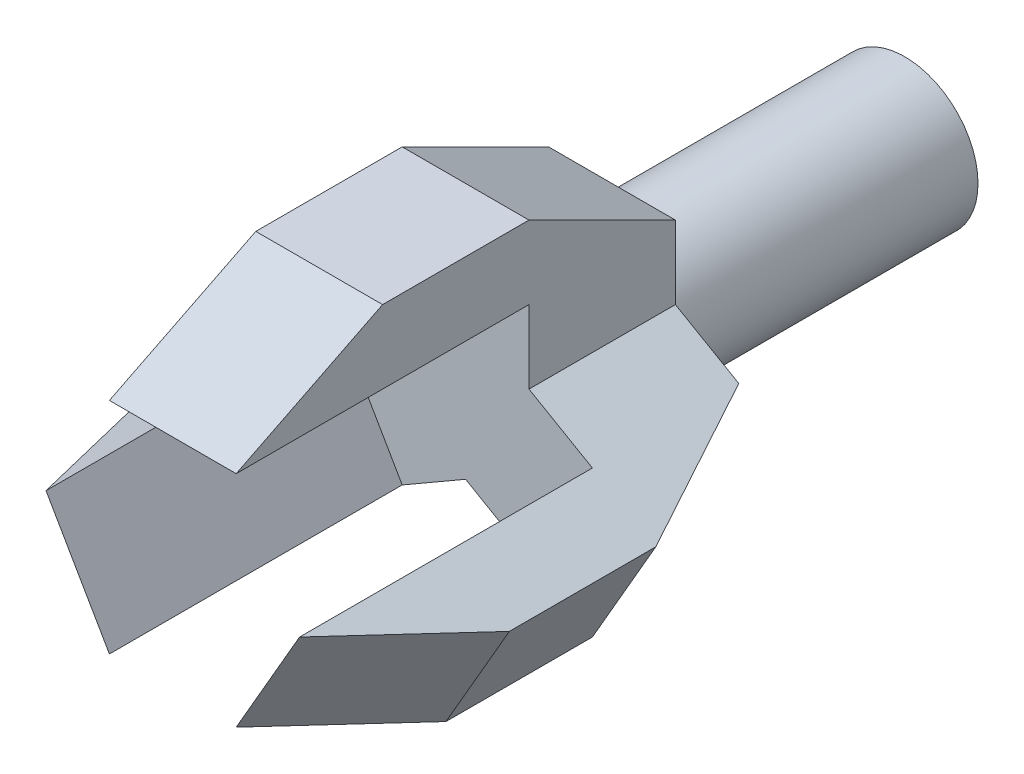
ISO-10303-21;
HEADER;
FILE_DESCRIPTION(('STEP AP214'),'2;1');
FILE_NAME('part.step','',(''),(''),'','','');
FILE_SCHEMA(('AUTOMOTIVE_DESIGN { 1 0 10303 214 1 1 1 1 }'));
ENDSEC;
DATA;
#1=APPLICATION_CONTEXT('core data for automotive mechanical design processes');
#2=APPLICATION_PROTOCOL_DEFINITION('international standard','automotive_design',2000,#1);
#3=PRODUCT_CONTEXT('',#1,'mechanical');
#4=PRODUCT('Part','Part','',(#3));
#5=PRODUCT_RELATED_PRODUCT_CATEGORY('part','',(#4));
#6=PRODUCT_DEFINITION_FORMATION('','',#4);
#7=PRODUCT_DEFINITION_CONTEXT('part definition',#1,'design');
#8=PRODUCT_DEFINITION('design','',#6,#7);
#9=PRODUCT_DEFINITION_SHAPE('','',#8);
#10=(LENGTH_UNIT() NAMED_UNIT(*) SI_UNIT(.MILLI.,.METRE.));
#11=(NAMED_UNIT(*) PLANE_ANGLE_UNIT() SI_UNIT($,.RADIAN.));
#12=(NAMED_UNIT(*) SI_UNIT($,.STERADIAN.) SOLID_ANGLE_UNIT());
#13=UNCERTAINTY_MEASURE_WITH_UNIT(LENGTH_MEASURE(1.E-05),#10,'distance_accuracy_value','');
#14=(GEOMETRIC_REPRESENTATION_CONTEXT(3) GLOBAL_UNCERTAINTY_ASSIGNED_CONTEXT((#13)) GLOBAL_UNIT_ASSIGNED_CONTEXT((#10,
#11,#12)) REPRESENTATION_CONTEXT('',''));
#15=CARTESIAN_POINT('',(0.,0.,0.));
#16=DIRECTION('',(0.,0.,1.));
#17=DIRECTION('',(1.,0.,0.));
#18=AXIS2_PLACEMENT_3D('',#15,#16,#17);
#19=CARTESIAN_POINT('',(0.,0.,200.));
#20=DIRECTION('',(0.,0.,-1.));
#21=DIRECTION('',(-1.,0.,0.));
#22=AXIS2_PLACEMENT_3D('',#19,#20,#21);
#23=CYLINDRICAL_SURFACE('',#22,50.);
#24=CARTESIAN_POINT('',(0.,0.,200.));
#25=DIRECTION('',(0.,0.,1.));
#26=DIRECTION('',(1.,0.,0.));
#27=AXIS2_PLACEMENT_3D('',#24,#25,#26);
#28=CIRCLE('',#27,50.);
#29=CARTESIAN_POINT('',(43.3012701892225,24.999999999999,200.));
#30=VERTEX_POINT('',#29);
#31=CARTESIAN_POINT('',(-43.3012701892218,25.0000000000002,200.));
#32=VERTEX_POINT('',#31);
#33=EDGE_CURVE('E11',#30,#32,#28,.T.);
#34=ORIENTED_EDGE('',*,*,#33,.F.);
#35=CARTESIAN_POINT('',(0.,0.,200.));
#36=DIRECTION('',(0.,0.,1.));
#37=DIRECTION('',(1.,0.,0.));
#38=AXIS2_PLACEMENT_3D('',#35,#36,#37);
#39=CIRCLE('',#38,50.);
#40=CARTESIAN_POINT('',(0.,-50.,200.));
#41=VERTEX_POINT('',#40);
#42=EDGE_CURVE('E361',#41,#30,#39,.T.);
#43=ORIENTED_EDGE('',*,*,#42,.F.);
#44=EDGE_CURVE('E41',#32,#41,#28,.T.);
#45=ORIENTED_EDGE('',*,*,#44,.F.);
#46=EDGE_LOOP('',(#34,#43,#45));
#47=FACE_BOUND('',#46,.T.);
#48=CARTESIAN_POINT('',(0.,0.,0.));
#49=DIRECTION('',(0.,0.,1.));
#50=DIRECTION('',(1.,0.,0.));
#51=AXIS2_PLACEMENT_3D('',#48,#49,#50);
#52=CIRCLE('',#51,50.);
#53=CARTESIAN_POINT('',(50.,0.,0.));
#54=VERTEX_POINT('',#53);
#55=EDGE_CURVE('E309',#54,#54,#52,.T.);
#56=ORIENTED_EDGE('',*,*,#55,.T.);
#57=EDGE_LOOP('',(#56));
#58=FACE_BOUND('',#57,.T.);
#59=ADVANCED_FACE('F33',(#47,#58),#23,.T.);
#60=CARTESIAN_POINT('',(0.,0.,0.));
#61=DIRECTION('',(0.,0.,1.));
#62=DIRECTION('',(1.,0.,0.));
#63=AXIS2_PLACEMENT_3D('',#60,#61,#62);
#64=PLANE('',#63);
#65=ORIENTED_EDGE('',*,*,#55,.F.);
#66=EDGE_LOOP('',(#65));
#67=FACE_BOUND('',#66,.T.);
#68=ADVANCED_FACE('F406',(#67),#64,.F.);
#69=CARTESIAN_POINT('',(5.20062834568508E-13,2.33066452422245E-13,200.));
#70=DIRECTION('',(0.,0.,1.));
#71=DIRECTION('',(1.,0.,0.));
#72=AXIS2_PLACEMENT_3D('',#69,#70,#71);
#73=PLANE('',#72);
#74=DIRECTION('',(0.,1.,0.));
#75=VECTOR('',#74,1.);
#76=CARTESIAN_POINT('',(43.3012701892218,25.0000000000002,200.));
#77=LINE('',#76,#75);
#78=CARTESIAN_POINT('',(43.3012701892224,75.0000000000016,200.));
#79=VERTEX_POINT('',#78);
#80=EDGE_CURVE('E324',#30,#79,#77,.T.);
#81=ORIENTED_EDGE('',*,*,#80,.F.);
#82=ORIENTED_EDGE('',*,*,#33,.T.);
#83=DIRECTION('',(0.,-1.,0.));
#84=VECTOR('',#83,1.);
#85=CARTESIAN_POINT('',(-43.3012701892211,74.9999999999998,200.));
#86=LINE('',#85,#84);
#87=CARTESIAN_POINT('',(-43.3012701892211,75.0000000000022,200.));
#88=VERTEX_POINT('',#87);
#89=EDGE_CURVE('E305',#88,#32,#86,.T.);
#90=ORIENTED_EDGE('',*,*,#89,.F.);
#91=DIRECTION('',(-1.,0.,0.));
#92=VECTOR('',#91,1.);
#93=CARTESIAN_POINT('',(43.3012701892223,74.9999999999991,200.));
#94=LINE('',#93,#92);
#95=EDGE_CURVE('E326',#79,#88,#94,.T.);
#96=ORIENTED_EDGE('',*,*,#95,.F.);
#97=EDGE_LOOP('',(#81,#82,#90,#96));
#98=FACE_BOUND('',#97,.T.);
#99=ADVANCED_FACE('F384',(#98),#73,.F.);
#100=CARTESIAN_POINT('',(43.3012701892218,25.0000000000002,300.));
#101=DIRECTION('',(-1.,0.,0.));
#102=DIRECTION('',(0.,-1.,0.));
#103=AXIS2_PLACEMENT_3D('',#100,#101,#102);
#104=PLANE('',#103);
#105=ORIENTED_EDGE('',*,*,#80,.T.);
#106=DIRECTION('',(0.,0.447213595499957,0.894427190999916));
#107=VECTOR('',#106,1.);
#108=CARTESIAN_POINT('',(43.3012701892224,75.0000000000017,200.));
#109=LINE('',#108,#107);
#110=CARTESIAN_POINT('',(43.3012701892228,125.000000000001,300.));
#111=VERTEX_POINT('',#110);
#112=EDGE_CURVE('E341',#79,#111,#109,.T.);
#113=ORIENTED_EDGE('',*,*,#112,.T.);
#114=DIRECTION('',(0.,0.,1.));
#115=VECTOR('',#114,1.);
#116=CARTESIAN_POINT('',(43.3012701892228,125.000000000001,300.));
#117=LINE('',#116,#115);
#118=CARTESIAN_POINT('',(43.3012701892228,125.000000000001,400.));
#119=VERTEX_POINT('',#118);
#120=EDGE_CURVE('E342',#111,#119,#117,.T.);
#121=ORIENTED_EDGE('',*,*,#120,.T.);
#122=DIRECTION('',(0.,-0.447213595499957,0.894427190999916));
#123=VECTOR('',#122,1.);
#124=CARTESIAN_POINT('',(43.3012701892228,125.000000000002,400.));
#125=LINE('',#124,#123);
#126=CARTESIAN_POINT('',(43.3012701892224,75.0000000000016,500.));
#127=VERTEX_POINT('',#126);
#128=EDGE_CURVE('E339',#119,#127,#125,.T.);
#129=ORIENTED_EDGE('',*,*,#128,.T.);
#130=DIRECTION('',(0.,0.,-1.));
#131=VECTOR('',#130,1.);
#132=CARTESIAN_POINT('',(43.3012701892224,75.0000000000016,200.));
#133=LINE('',#132,#131);
#134=CARTESIAN_POINT('',(43.3012701892224,75.0000000000016,300.));
#135=VERTEX_POINT('',#134);
#136=EDGE_CURVE('E327',#127,#135,#133,.T.);
#137=ORIENTED_EDGE('',*,*,#136,.T.);
#138=DIRECTION('',(0.,1.,0.));
#139=VECTOR('',#138,1.);
#140=CARTESIAN_POINT('',(43.3012701892218,25.0000000000002,300.));
#141=LINE('',#140,#139);
#142=CARTESIAN_POINT('',(43.3012701892225,24.999999999999,300.));
#143=VERTEX_POINT('',#142);
#144=EDGE_CURVE('E317',#143,#135,#141,.T.);
#145=ORIENTED_EDGE('',*,*,#144,.F.);
#146=DIRECTION('',(0.,0.,-1.));
#147=VECTOR('',#146,1.);
#148=CARTESIAN_POINT('',(43.3012701892218,25.0000000000002,300.));
#149=LINE('',#148,#147);
#150=EDGE_CURVE('E306',#143,#30,#149,.T.);
#151=ORIENTED_EDGE('',*,*,#150,.T.);
#152=EDGE_LOOP('',(#105,#113,#121,#129,#137,#145,#151));
#153=FACE_BOUND('',#152,.T.);
#154=ADVANCED_FACE('F336',(#153),#104,.F.);
#155=CARTESIAN_POINT('',(-43.3012701892211,74.9999999999998,300.));
#156=DIRECTION('',(1.,0.,0.));
#157=DIRECTION('',(0.,1.,0.));
#158=AXIS2_PLACEMENT_3D('',#155,#156,#157);
#159=PLANE('',#158);
#160=ORIENTED_EDGE('',*,*,#89,.T.);
#161=DIRECTION('',(0.,0.,-1.));
#162=VECTOR('',#161,1.);
#163=CARTESIAN_POINT('',(-43.3012701892215,25.0000000000008,300.));
#164=LINE('',#163,#162);
#165=CARTESIAN_POINT('',(-43.3012701892218,25.0000000000002,300.));
#166=VERTEX_POINT('',#165);
#167=EDGE_CURVE('E299',#166,#32,#164,.T.);
#168=ORIENTED_EDGE('',*,*,#167,.F.);
#169=DIRECTION('',(0.,-1.,0.));
#170=VECTOR('',#169,1.);
#171=CARTESIAN_POINT('',(-43.3012701892211,74.9999999999998,300.));
#172=LINE('',#171,#170);
#173=CARTESIAN_POINT('',(-43.3012701892211,74.9999999999998,300.));
#174=VERTEX_POINT('',#173);
#175=EDGE_CURVE('E295',#174,#166,#172,.T.);
#176=ORIENTED_EDGE('',*,*,#175,.F.);
#177=DIRECTION('',(0.,0.,1.));
#178=VECTOR('',#177,1.);
#179=CARTESIAN_POINT('',(-43.3012701892211,75.0000000000022,200.));
#180=LINE('',#179,#178);
#181=CARTESIAN_POINT('',(-43.3012701892211,75.0000000000022,500.));
#182=VERTEX_POINT('',#181);
#183=EDGE_CURVE('E49',#174,#182,#180,.T.);
#184=ORIENTED_EDGE('',*,*,#183,.T.);
#185=DIRECTION('',(0.,0.447213595499957,-0.894427190999916));
#186=VECTOR('',#185,1.);
#187=CARTESIAN_POINT('',(-43.3012701892208,125.000000000002,400.));
#188=LINE('',#187,#186);
#189=CARTESIAN_POINT('',(-43.3012701892208,125.000000000002,400.));
#190=VERTEX_POINT('',#189);
#191=EDGE_CURVE('E356',#182,#190,#188,.T.);
#192=ORIENTED_EDGE('',*,*,#191,.T.);
#193=DIRECTION('',(0.,0.,-1.));
#194=VECTOR('',#193,1.);
#195=CARTESIAN_POINT('',(-43.3012701892208,125.000000000002,300.));
#196=LINE('',#195,#194);
#197=CARTESIAN_POINT('',(-43.3012701892208,125.000000000002,300.));
#198=VERTEX_POINT('',#197);
#199=EDGE_CURVE('E350',#190,#198,#196,.T.);
#200=ORIENTED_EDGE('',*,*,#199,.T.);
#201=DIRECTION('',(0.,-0.447213595499957,-0.894427190999916));
#202=VECTOR('',#201,1.);
#203=CARTESIAN_POINT('',(-43.3012701892211,75.0000000000022,200.));
#204=LINE('',#203,#202);
#205=EDGE_CURVE('E360',#198,#88,#204,.T.);
#206=ORIENTED_EDGE('',*,*,#205,.T.);
#207=EDGE_LOOP('',(#160,#168,#176,#184,#192,#200,#206));
#208=FACE_BOUND('',#207,.T.);
#209=ADVANCED_FACE('F302',(#208),#159,.F.);
#210=CARTESIAN_POINT('',(5.20062834568508E-13,2.33066452422245E-13,300.));
#211=DIRECTION('',(0.,0.,1.));
#212=DIRECTION('',(1.,0.,0.));
#213=AXIS2_PLACEMENT_3D('',#210,#211,#212);
#214=PLANE('',#213);
#215=DIRECTION('',(-0.866025403784433,0.50000000000001,0.));
#216=VECTOR('',#215,1.);
#217=CARTESIAN_POINT('',(86.6025403784433,-9.99200722162641E-13,300.));
#218=LINE('',#217,#216);
#219=CARTESIAN_POINT('',(86.6025403784433,-9.99200722162641E-13,300.));
#220=VERTEX_POINT('',#219);
#221=EDGE_CURVE('E200',#220,#143,#218,.T.);
#222=ORIENTED_EDGE('',*,*,#221,.T.);
#223=ORIENTED_EDGE('',*,*,#144,.T.);
#224=DIRECTION('',(-1.,0.,0.));
#225=VECTOR('',#224,1.);
#226=CARTESIAN_POINT('',(43.3012701892223,74.9999999999991,300.));
#227=LINE('',#226,#225);
#228=EDGE_CURVE('E53',#135,#174,#227,.T.);
#229=ORIENTED_EDGE('',*,*,#228,.T.);
#230=ORIENTED_EDGE('',*,*,#175,.T.);
#231=DIRECTION('',(-0.866025403784448,-0.499999999999984,0.));
#232=VECTOR('',#231,1.);
#233=CARTESIAN_POINT('',(-43.3012701892218,25.0000000000002,300.));
#234=LINE('',#233,#232);
#235=CARTESIAN_POINT('',(-86.6025403784454,3.28440978118276E-13,300.));
#236=VERTEX_POINT('',#235);
#237=EDGE_CURVE('E185',#166,#236,#234,.T.);
#238=ORIENTED_EDGE('',*,*,#237,.T.);
#239=DIRECTION('',(0.499999999999985,-0.866025403784447,0.));
#240=VECTOR('',#239,1.);
#241=CARTESIAN_POINT('',(-86.6025403784433,1.57512891618694E-12,300.));
#242=LINE('',#241,#240);
#243=CARTESIAN_POINT('',(-43.3012701892229,-74.9999999999988,300.));
#244=VERTEX_POINT('',#243);
#245=EDGE_CURVE('E188',#236,#244,#242,.T.);
#246=ORIENTED_EDGE('',*,*,#245,.T.);
#247=DIRECTION('',(0.866025403784447,0.499999999999986,0.));
#248=VECTOR('',#247,1.);
#249=CARTESIAN_POINT('',(-43.3012701892229,-74.9999999999988,300.));
#250=LINE('',#249,#248);
#251=CARTESIAN_POINT('',(0.,-50.,300.));
#252=VERTEX_POINT('',#251);
#253=EDGE_CURVE('E216',#244,#252,#250,.T.);
#254=ORIENTED_EDGE('',*,*,#253,.T.);
#255=DIRECTION('',(0.866025403784432,-0.500000000000012,0.));
#256=VECTOR('',#255,1.);
#257=CARTESIAN_POINT('',(0.,-50.,300.));
#258=LINE('',#257,#256);
#259=CARTESIAN_POINT('',(43.3012701892228,-75.0000000000013,300.));
#260=VERTEX_POINT('',#259);
#261=EDGE_CURVE('E201',#252,#260,#258,.T.);
#262=ORIENTED_EDGE('',*,*,#261,.T.);
#263=DIRECTION('',(0.500000000000011,0.866025403784433,0.));
#264=VECTOR('',#263,1.);
#265=CARTESIAN_POINT('',(43.3012701892206,-75.0000000000001,300.));
#266=LINE('',#265,#264);
#267=EDGE_CURVE('E196',#260,#220,#266,.T.);
#268=ORIENTED_EDGE('',*,*,#267,.T.);
#269=EDGE_LOOP('',(#222,#223,#229,#230,#238,#246,#254,#262,#268));
#270=FACE_BOUND('',#269,.T.);
#271=ADVANCED_FACE('F292',(#270),#214,.T.);
#272=CARTESIAN_POINT('',(347.439396704133,74.9999999999993,200.));
#273=DIRECTION('',(0.,-1.,0.));
#274=DIRECTION('',(1.,0.,0.));
#275=AXIS2_PLACEMENT_3D('',#272,#273,#274);
#276=PLANE('',#275);
#277=ORIENTED_EDGE('',*,*,#228,.F.);
#278=ORIENTED_EDGE('',*,*,#136,.F.);
#279=DIRECTION('',(-1.,0.,0.));
#280=VECTOR('',#279,1.);
#281=CARTESIAN_POINT('',(347.439396704133,74.9999999999994,500.));
#282=LINE('',#281,#280);
#283=EDGE_CURVE('E347',#127,#182,#282,.T.);
#284=ORIENTED_EDGE('',*,*,#283,.T.);
#285=ORIENTED_EDGE('',*,*,#183,.F.);
#286=EDGE_LOOP('',(#277,#278,#284,#285));
#287=FACE_BOUND('',#286,.T.);
#288=ADVANCED_FACE('F395',(#287),#276,.T.);
#289=CARTESIAN_POINT('',(347.439396704133,74.9999999999993,200.));
#290=DIRECTION('',(0.,0.894427190999916,-0.447213595499957));
#291=DIRECTION('',(0.,0.447213595499957,0.894427190999916));
#292=AXIS2_PLACEMENT_3D('',#289,#290,#291);
#293=PLANE('',#292);
#294=ORIENTED_EDGE('',*,*,#112,.F.);
#295=ORIENTED_EDGE('',*,*,#95,.T.);
#296=ORIENTED_EDGE('',*,*,#205,.F.);
#297=DIRECTION('',(-1.,0.,0.));
#298=VECTOR('',#297,1.);
#299=CARTESIAN_POINT('',(347.439396704134,124.999999999999,300.));
#300=LINE('',#299,#298);
#301=EDGE_CURVE('E352',#111,#198,#300,.T.);
#302=ORIENTED_EDGE('',*,*,#301,.F.);
#303=EDGE_LOOP('',(#294,#295,#296,#302));
#304=FACE_BOUND('',#303,.T.);
#305=ADVANCED_FACE('F391',(#304),#293,.T.);
#306=CARTESIAN_POINT('',(347.439396704134,124.999999999999,300.));
#307=DIRECTION('',(0.,1.,0.));
#308=DIRECTION('',(-1.,0.,0.));
#309=AXIS2_PLACEMENT_3D('',#306,#307,#308);
#310=PLANE('',#309);
#311=ORIENTED_EDGE('',*,*,#120,.F.);
#312=ORIENTED_EDGE('',*,*,#301,.T.);
#313=ORIENTED_EDGE('',*,*,#199,.F.);
#314=DIRECTION('',(-1.,0.,0.));
#315=VECTOR('',#314,1.);
#316=CARTESIAN_POINT('',(347.439396704134,124.999999999999,400.));
#317=LINE('',#316,#315);
#318=EDGE_CURVE('E349',#119,#190,#317,.T.);
#319=ORIENTED_EDGE('',*,*,#318,.F.);
#320=EDGE_LOOP('',(#311,#312,#313,#319));
#321=FACE_BOUND('',#320,.T.);
#322=ADVANCED_FACE('F389',(#321),#310,.T.);
#323=CARTESIAN_POINT('',(347.439396704134,124.999999999999,400.));
#324=DIRECTION('',(0.,0.894427190999916,0.447213595499957));
#325=DIRECTION('',(0.,-0.447213595499957,0.894427190999916));
#326=AXIS2_PLACEMENT_3D('',#323,#324,#325);
#327=PLANE('',#326);
#328=ORIENTED_EDGE('',*,*,#128,.F.);
#329=ORIENTED_EDGE('',*,*,#318,.T.);
#330=ORIENTED_EDGE('',*,*,#191,.F.);
#331=ORIENTED_EDGE('',*,*,#283,.F.);
#332=EDGE_LOOP('',(#328,#329,#330,#331));
#333=FACE_BOUND('',#332,.T.);
#334=ADVANCED_FACE('F394',(#333),#327,.T.);
#335=CARTESIAN_POINT('',(0.,-5.66920852511594E-13,200.));
#336=DIRECTION('',(0.,0.,1.));
#337=DIRECTION('',(-0.500000000000004,-0.866025403784436,0.));
#338=AXIS2_PLACEMENT_3D('',#335,#336,#337);
#339=PLANE('',#338);
#340=DIRECTION('',(-0.866025403784448,-0.499999999999984,0.));
#341=VECTOR('',#340,1.);
#342=CARTESIAN_POINT('',(-43.3012701892218,25.0000000000002,200.));
#343=LINE('',#342,#341);
#344=CARTESIAN_POINT('',(-86.6025403784453,3.33066907387547E-13,200.));
#345=VERTEX_POINT('',#344);
#346=EDGE_CURVE('E170',#32,#345,#343,.T.);
#347=ORIENTED_EDGE('',*,*,#346,.F.);
#348=ORIENTED_EDGE('',*,*,#44,.T.);
#349=DIRECTION('',(0.866025403784447,0.499999999999986,0.));
#350=VECTOR('',#349,1.);
#351=CARTESIAN_POINT('',(-43.3012701892229,-74.9999999999988,200.));
#352=LINE('',#351,#350);
#353=CARTESIAN_POINT('',(-43.3012701892249,-75.,200.));
#354=VERTEX_POINT('',#353);
#355=EDGE_CURVE('E169',#354,#41,#352,.T.);
#356=ORIENTED_EDGE('',*,*,#355,.F.);
#357=DIRECTION('',(0.499999999999985,-0.866025403784447,0.));
#358=VECTOR('',#357,1.);
#359=CARTESIAN_POINT('',(-86.6025403784433,1.57512891618694E-12,200.));
#360=LINE('',#359,#358);
#361=EDGE_CURVE('E158',#345,#354,#360,.T.);
#362=ORIENTED_EDGE('',*,*,#361,.F.);
#363=EDGE_LOOP('',(#347,#348,#356,#362));
#364=FACE_BOUND('',#363,.T.);
#365=ADVANCED_FACE('F182',(#364),#339,.F.);
#366=DIRECTION('',(0.866025403784432,-0.500000000000012,0.));
#367=VECTOR('',#366,1.);
#368=CARTESIAN_POINT('',(0.,-50.,200.));
#369=LINE('',#368,#367);
#370=CARTESIAN_POINT('',(43.3012701892228,-75.0000000000013,200.));
#371=VERTEX_POINT('',#370);
#372=EDGE_CURVE('E193',#41,#371,#369,.T.);
#373=ORIENTED_EDGE('',*,*,#372,.F.);
#374=ORIENTED_EDGE('',*,*,#42,.T.);
#375=DIRECTION('',(-0.866025403784433,0.50000000000001,0.));
#376=VECTOR('',#375,1.);
#377=CARTESIAN_POINT('',(86.6025403784433,-9.99200722162641E-13,200.));
#378=LINE('',#377,#376);
#379=CARTESIAN_POINT('',(86.6025403784454,-2.19269047363468E-12,200.));
#380=VERTEX_POINT('',#379);
#381=EDGE_CURVE('E210',#380,#30,#378,.T.);
#382=ORIENTED_EDGE('',*,*,#381,.F.);
#383=DIRECTION('',(0.500000000000011,0.866025403784433,0.));
#384=VECTOR('',#383,1.);
#385=CARTESIAN_POINT('',(43.3012701892206,-75.0000000000001,200.));
#386=LINE('',#385,#384);
#387=EDGE_CURVE('E368',#371,#380,#386,.T.);
#388=ORIENTED_EDGE('',*,*,#387,.F.);
#389=EDGE_LOOP('',(#373,#374,#382,#388));
#390=FACE_BOUND('',#389,.T.);
#391=ADVANCED_FACE('F376',(#390),#339,.F.);
#392=CARTESIAN_POINT('',(0.,-50.,300.));
#393=DIRECTION('',(0.500000000000012,0.866025403784432,0.));
#394=DIRECTION('',(-0.866025403784432,0.500000000000012,0.));
#395=AXIS2_PLACEMENT_3D('',#392,#393,#394);
#396=PLANE('',#395);
#397=ORIENTED_EDGE('',*,*,#372,.T.);
#398=DIRECTION('',(0.387298334620738,-0.223606797749984,0.894427190999916));
#399=VECTOR('',#398,1.);
#400=CARTESIAN_POINT('',(43.3012701892229,-75.0000000000014,200.));
#401=LINE('',#400,#399);
#402=CARTESIAN_POINT('',(86.6025403784443,-100.000000000002,300.));
#403=VERTEX_POINT('',#402);
#404=EDGE_CURVE('E226',#371,#403,#401,.T.);
#405=ORIENTED_EDGE('',*,*,#404,.T.);
#406=DIRECTION('',(0.,0.,1.));
#407=VECTOR('',#406,1.);
#408=CARTESIAN_POINT('',(86.6025403784443,-100.000000000002,300.));
#409=LINE('',#408,#407);
#410=CARTESIAN_POINT('',(86.6025403784442,-100.000000000002,400.));
#411=VERTEX_POINT('',#410);
#412=EDGE_CURVE('E229',#403,#411,#409,.T.);
#413=ORIENTED_EDGE('',*,*,#412,.T.);
#414=DIRECTION('',(-0.387298334620738,0.223606797749984,0.894427190999916));
#415=VECTOR('',#414,1.);
#416=CARTESIAN_POINT('',(86.6025403784444,-100.000000000002,400.));
#417=LINE('',#416,#415);
#418=CARTESIAN_POINT('',(43.3012701892228,-75.0000000000014,500.));
#419=VERTEX_POINT('',#418);
#420=EDGE_CURVE('E242',#411,#419,#417,.T.);
#421=ORIENTED_EDGE('',*,*,#420,.T.);
#422=DIRECTION('',(0.,0.,-1.));
#423=VECTOR('',#422,1.);
#424=CARTESIAN_POINT('',(43.3012701892228,-75.0000000000013,200.));
#425=LINE('',#424,#423);
#426=EDGE_CURVE('E223',#419,#260,#425,.T.);
#427=ORIENTED_EDGE('',*,*,#426,.T.);
#428=ORIENTED_EDGE('',*,*,#261,.F.);
#429=DIRECTION('',(0.,0.,-1.));
#430=VECTOR('',#429,1.);
#431=CARTESIAN_POINT('',(0.,-50.,300.));
#432=LINE('',#431,#430);
#433=EDGE_CURVE('E205',#252,#41,#432,.T.);
#434=ORIENTED_EDGE('',*,*,#433,.T.);
#435=EDGE_LOOP('',(#397,#405,#413,#421,#427,#428,#434));
#436=FACE_BOUND('',#435,.T.);
#437=ADVANCED_FACE('F374',(#436),#396,.F.);
#438=CARTESIAN_POINT('',(86.6025403784433,-9.99200722162641E-13,300.));
#439=DIRECTION('',(-0.50000000000001,-0.866025403784433,0.));
#440=DIRECTION('',(0.866025403784433,-0.50000000000001,0.));
#441=AXIS2_PLACEMENT_3D('',#438,#439,#440);
#442=PLANE('',#441);
#443=ORIENTED_EDGE('',*,*,#381,.T.);
#444=ORIENTED_EDGE('',*,*,#150,.F.);
#445=ORIENTED_EDGE('',*,*,#221,.F.);
#446=DIRECTION('',(0.,0.,1.));
#447=VECTOR('',#446,1.);
#448=CARTESIAN_POINT('',(86.6025403784454,-2.19269047363468E-12,200.));
#449=LINE('',#448,#447);
#450=CARTESIAN_POINT('',(86.6025403784454,-2.2065682614425E-12,500.));
#451=VERTEX_POINT('',#450);
#452=EDGE_CURVE('E220',#220,#451,#449,.T.);
#453=ORIENTED_EDGE('',*,*,#452,.T.);
#454=DIRECTION('',(0.387298334620738,-0.223606797749983,-0.894427190999916));
#455=VECTOR('',#454,1.);
#456=CARTESIAN_POINT('',(129.903810567667,-25.0000000000027,400.));
#457=LINE('',#456,#455);
#458=CARTESIAN_POINT('',(129.903810567667,-25.0000000000027,400.));
#459=VERTEX_POINT('',#458);
#460=EDGE_CURVE('E245',#451,#459,#457,.T.);
#461=ORIENTED_EDGE('',*,*,#460,.T.);
#462=DIRECTION('',(0.,0.,-1.));
#463=VECTOR('',#462,1.);
#464=CARTESIAN_POINT('',(129.903810567667,-25.0000000000027,300.));
#465=LINE('',#464,#463);
#466=CARTESIAN_POINT('',(129.903810567667,-25.0000000000027,300.));
#467=VERTEX_POINT('',#466);
#468=EDGE_CURVE('E238',#459,#467,#465,.T.);
#469=ORIENTED_EDGE('',*,*,#468,.T.);
#470=DIRECTION('',(-0.387298334620739,0.223606797749983,-0.894427190999916));
#471=VECTOR('',#470,1.);
#472=CARTESIAN_POINT('',(86.6025403784454,-2.19269047363468E-12,200.));
#473=LINE('',#472,#471);
#474=EDGE_CURVE('E249',#467,#380,#473,.T.);
#475=ORIENTED_EDGE('',*,*,#474,.T.);
#476=EDGE_LOOP('',(#443,#444,#445,#453,#461,#469,#475));
#477=FACE_BOUND('',#476,.T.);
#478=ADVANCED_FACE('F380',(#477),#442,.F.);
#479=CARTESIAN_POINT('',(-43.3012701892218,25.0000000000002,300.));
#480=DIRECTION('',(0.499999999999984,-0.866025403784448,0.));
#481=DIRECTION('',(0.866025403784448,0.499999999999984,0.));
#482=AXIS2_PLACEMENT_3D('',#479,#480,#481);
#483=PLANE('',#482);
#484=ORIENTED_EDGE('',*,*,#346,.T.);
#485=DIRECTION('',(-0.387298334620745,-0.223606797749971,0.894427190999916));
#486=VECTOR('',#485,1.);
#487=CARTESIAN_POINT('',(-86.6025403784456,2.22044604925031E-13,200.000000000001));
#488=LINE('',#487,#486);
#489=CARTESIAN_POINT('',(-129.903810567668,-24.9999999999989,300.));
#490=VERTEX_POINT('',#489);
#491=EDGE_CURVE('E164',#345,#490,#488,.T.);
#492=ORIENTED_EDGE('',*,*,#491,.T.);
#493=DIRECTION('',(0.,0.,1.));
#494=VECTOR('',#493,1.);
#495=CARTESIAN_POINT('',(-129.903810567668,-24.9999999999989,300.));
#496=LINE('',#495,#494);
#497=CARTESIAN_POINT('',(-129.903810567668,-24.9999999999988,400.));
#498=VERTEX_POINT('',#497);
#499=EDGE_CURVE('E286',#490,#498,#496,.T.);
#500=ORIENTED_EDGE('',*,*,#499,.T.);
#501=DIRECTION('',(0.387298334620745,0.223606797749971,0.894427190999917));
#502=VECTOR('',#501,1.);
#503=CARTESIAN_POINT('',(-129.903810567668,-24.9999999999989,400.));
#504=LINE('',#503,#502);
#505=CARTESIAN_POINT('',(-86.6025403784455,4.44089209850063E-13,500.));
#506=VERTEX_POINT('',#505);
#507=EDGE_CURVE('E267',#498,#506,#504,.T.);
#508=ORIENTED_EDGE('',*,*,#507,.T.);
#509=DIRECTION('',(0.,0.,-1.));
#510=VECTOR('',#509,1.);
#511=CARTESIAN_POINT('',(-86.6025403784453,3.33066907387547E-13,200.));
#512=LINE('',#511,#510);
#513=EDGE_CURVE('E251',#506,#236,#512,.T.);
#514=ORIENTED_EDGE('',*,*,#513,.T.);
#515=ORIENTED_EDGE('',*,*,#237,.F.);
#516=ORIENTED_EDGE('',*,*,#167,.T.);
#517=EDGE_LOOP('',(#484,#492,#500,#508,#514,#515,#516));
#518=FACE_BOUND('',#517,.T.);
#519=ADVANCED_FACE('F289',(#518),#483,.F.);
#520=CARTESIAN_POINT('',(-43.3012701892229,-74.9999999999988,300.));
#521=DIRECTION('',(-0.499999999999986,0.866025403784447,0.));
#522=DIRECTION('',(-0.866025403784447,-0.499999999999986,0.));
#523=AXIS2_PLACEMENT_3D('',#520,#521,#522);
#524=PLANE('',#523);
#525=ORIENTED_EDGE('',*,*,#355,.T.);
#526=ORIENTED_EDGE('',*,*,#433,.F.);
#527=ORIENTED_EDGE('',*,*,#253,.F.);
#528=DIRECTION('',(0.,0.,1.));
#529=VECTOR('',#528,1.);
#530=CARTESIAN_POINT('',(-43.3012701892249,-75.,200.));
#531=LINE('',#530,#529);
#532=CARTESIAN_POINT('',(-43.301270189225,-75.,500.));
#533=VERTEX_POINT('',#532);
#534=EDGE_CURVE('E180',#244,#533,#531,.T.);
#535=ORIENTED_EDGE('',*,*,#534,.T.);
#536=DIRECTION('',(-0.387298334620745,-0.223606797749972,-0.894427190999916));
#537=VECTOR('',#536,1.);
#538=CARTESIAN_POINT('',(-86.6025403784472,-99.9999999999992,400.));
#539=LINE('',#538,#537);
#540=CARTESIAN_POINT('',(-86.6025403784472,-99.9999999999992,400.));
#541=VERTEX_POINT('',#540);
#542=EDGE_CURVE('E257',#533,#541,#539,.T.);
#543=ORIENTED_EDGE('',*,*,#542,.T.);
#544=DIRECTION('',(0.,0.,-1.));
#545=VECTOR('',#544,1.);
#546=CARTESIAN_POINT('',(-86.6025403784472,-99.9999999999993,300.));
#547=LINE('',#546,#545);
#548=CARTESIAN_POINT('',(-86.6025403784472,-99.9999999999993,300.));
#549=VERTEX_POINT('',#548);
#550=EDGE_CURVE('E179',#541,#549,#547,.T.);
#551=ORIENTED_EDGE('',*,*,#550,.T.);
#552=DIRECTION('',(0.387298334620745,0.223606797749972,-0.894427190999916));
#553=VECTOR('',#552,1.);
#554=CARTESIAN_POINT('',(-43.3012701892249,-75.,200.));
#555=LINE('',#554,#553);
#556=EDGE_CURVE('E162',#549,#354,#555,.T.);
#557=ORIENTED_EDGE('',*,*,#556,.T.);
#558=EDGE_LOOP('',(#525,#526,#527,#535,#543,#551,#557));
#559=FACE_BOUND('',#558,.T.);
#560=ADVANCED_FACE('F174',(#559),#524,.F.);
#561=CARTESIAN_POINT('',(-206.452959791578,-507.587015731978,200.));
#562=DIRECTION('',(-0.866025403784433,0.50000000000001,0.));
#563=DIRECTION('',(-0.50000000000001,-0.866025403784433,0.));
#564=AXIS2_PLACEMENT_3D('',#561,#562,#563);
#565=PLANE('',#564);
#566=ORIENTED_EDGE('',*,*,#267,.F.);
#567=ORIENTED_EDGE('',*,*,#426,.F.);
#568=DIRECTION('',(0.50000000000001,0.866025403784433,0.));
#569=VECTOR('',#568,1.);
#570=CARTESIAN_POINT('',(-206.452959791578,-507.587015731978,500.));
#571=LINE('',#570,#569);
#572=EDGE_CURVE('E234',#419,#451,#571,.T.);
#573=ORIENTED_EDGE('',*,*,#572,.T.);
#574=ORIENTED_EDGE('',*,*,#452,.F.);
#575=EDGE_LOOP('',(#566,#567,#573,#574));
#576=FACE_BOUND('',#575,.T.);
#577=ADVANCED_FACE('F483',(#576),#565,.T.);
#578=CARTESIAN_POINT('',(-206.452959791578,-507.587015731978,200.));
#579=DIRECTION('',(0.774596669241478,-0.447213595499967,-0.447213595499957));
#580=DIRECTION('',(0.50000000000001,0.866025403784433,0.));
#581=AXIS2_PLACEMENT_3D('',#578,#579,#580);
#582=PLANE('',#581);
#583=ORIENTED_EDGE('',*,*,#404,.F.);
#584=ORIENTED_EDGE('',*,*,#387,.T.);
#585=ORIENTED_EDGE('',*,*,#474,.F.);
#586=DIRECTION('',(0.50000000000001,0.866025403784433,0.));
#587=VECTOR('',#586,1.);
#588=CARTESIAN_POINT('',(-163.151689602356,-532.587015731978,300.));
#589=LINE('',#588,#587);
#590=EDGE_CURVE('E240',#403,#467,#589,.T.);
#591=ORIENTED_EDGE('',*,*,#590,.F.);
#592=EDGE_LOOP('',(#583,#584,#585,#591));
#593=FACE_BOUND('',#592,.T.);
#594=ADVANCED_FACE('F492',(#593),#582,.T.);
#595=CARTESIAN_POINT('',(-163.151689602356,-532.587015731978,300.));
#596=DIRECTION('',(0.866025403784433,-0.50000000000001,0.));
#597=DIRECTION('',(0.50000000000001,0.866025403784433,0.));
#598=AXIS2_PLACEMENT_3D('',#595,#596,#597);
#599=PLANE('',#598);
#600=ORIENTED_EDGE('',*,*,#412,.F.);
#601=ORIENTED_EDGE('',*,*,#590,.T.);
#602=ORIENTED_EDGE('',*,*,#468,.F.);
#603=DIRECTION('',(0.50000000000001,0.866025403784433,0.));
#604=VECTOR('',#603,1.);
#605=CARTESIAN_POINT('',(-163.151689602356,-532.587015731978,400.));
#606=LINE('',#605,#604);
#607=EDGE_CURVE('E237',#411,#459,#606,.T.);
#608=ORIENTED_EDGE('',*,*,#607,.F.);
#609=EDGE_LOOP('',(#600,#601,#602,#608));
#610=FACE_BOUND('',#609,.T.);
#611=ADVANCED_FACE('F502',(#610),#599,.T.);
#612=CARTESIAN_POINT('',(-163.151689602356,-532.587015731978,400.));
#613=DIRECTION('',(0.774596669241478,-0.447213595499967,0.447213595499957));
#614=DIRECTION('',(0.50000000000001,0.866025403784433,0.));
#615=AXIS2_PLACEMENT_3D('',#612,#613,#614);
#616=PLANE('',#615);
#617=ORIENTED_EDGE('',*,*,#420,.F.);
#618=ORIENTED_EDGE('',*,*,#607,.T.);
#619=ORIENTED_EDGE('',*,*,#460,.F.);
#620=ORIENTED_EDGE('',*,*,#572,.F.);
#621=EDGE_LOOP('',(#617,#618,#619,#620));
#622=FACE_BOUND('',#621,.T.);
#623=ADVANCED_FACE('F511',(#622),#616,.T.);
#624=CARTESIAN_POINT('',(-379.658040548459,507.587015731992,200.));
#625=DIRECTION('',(0.866025403784447,0.499999999999986,0.));
#626=DIRECTION('',(-0.499999999999986,0.866025403784447,0.));
#627=AXIS2_PLACEMENT_3D('',#624,#625,#626);
#628=PLANE('',#627);
#629=ORIENTED_EDGE('',*,*,#245,.F.);
#630=ORIENTED_EDGE('',*,*,#513,.F.);
#631=DIRECTION('',(0.499999999999986,-0.866025403784447,0.));
#632=VECTOR('',#631,1.);
#633=CARTESIAN_POINT('',(-379.658040548459,507.587015731992,500.));
#634=LINE('',#633,#632);
#635=EDGE_CURVE('E264',#506,#533,#634,.T.);
#636=ORIENTED_EDGE('',*,*,#635,.T.);
#637=ORIENTED_EDGE('',*,*,#534,.F.);
#638=EDGE_LOOP('',(#629,#630,#636,#637));
#639=FACE_BOUND('',#638,.T.);
#640=ADVANCED_FACE('F276',(#639),#628,.T.);
#641=CARTESIAN_POINT('',(-379.658040548459,507.587015731992,200.));
#642=DIRECTION('',(-0.774596669241491,-0.447213595499945,-0.447213595499957));
#643=DIRECTION('',(-0.499999999999996,0.,0.866025403784441));
#644=AXIS2_PLACEMENT_3D('',#641,#642,#643);
#645=PLANE('',#644);
#646=ORIENTED_EDGE('',*,*,#491,.F.);
#647=ORIENTED_EDGE('',*,*,#361,.T.);
#648=ORIENTED_EDGE('',*,*,#556,.F.);
#649=DIRECTION('',(0.499999999999986,-0.866025403784447,0.));
#650=VECTOR('',#649,1.);
#651=CARTESIAN_POINT('',(-422.959310737681,482.587015731993,300.));
#652=LINE('',#651,#650);
#653=EDGE_CURVE('E265',#490,#549,#652,.T.);
#654=ORIENTED_EDGE('',*,*,#653,.F.);
#655=EDGE_LOOP('',(#646,#647,#648,#654));
#656=FACE_BOUND('',#655,.T.);
#657=ADVANCED_FACE('F160',(#656),#645,.T.);
#658=CARTESIAN_POINT('',(-422.959310737681,482.587015731993,300.));
#659=DIRECTION('',(-0.866025403784447,-0.499999999999986,0.));
#660=DIRECTION('',(0.499999999999986,-0.866025403784447,0.));
#661=AXIS2_PLACEMENT_3D('',#658,#659,#660);
#662=PLANE('',#661);
#663=ORIENTED_EDGE('',*,*,#499,.F.);
#664=ORIENTED_EDGE('',*,*,#653,.T.);
#665=ORIENTED_EDGE('',*,*,#550,.F.);
#666=DIRECTION('',(0.499999999999986,-0.866025403784447,0.));
#667=VECTOR('',#666,1.);
#668=CARTESIAN_POINT('',(-422.959310737681,482.587015731993,400.));
#669=LINE('',#668,#667);
#670=EDGE_CURVE('E268',#498,#541,#669,.T.);
#671=ORIENTED_EDGE('',*,*,#670,.F.);
#672=EDGE_LOOP('',(#663,#664,#665,#671));
#673=FACE_BOUND('',#672,.T.);
#674=ADVANCED_FACE('F285',(#673),#662,.T.);
#675=CARTESIAN_POINT('',(-422.959310737681,482.587015731993,400.));
#676=DIRECTION('',(-0.774596669241491,-0.447213595499945,0.447213595499957));
#677=DIRECTION('',(0.499999999999995,0.,0.866025403784441));
#678=AXIS2_PLACEMENT_3D('',#675,#676,#677);
#679=PLANE('',#678);
#680=ORIENTED_EDGE('',*,*,#507,.F.);
#681=ORIENTED_EDGE('',*,*,#670,.T.);
#682=ORIENTED_EDGE('',*,*,#542,.F.);
#683=ORIENTED_EDGE('',*,*,#635,.F.);
#684=EDGE_LOOP('',(#680,#681,#682,#683));
#685=FACE_BOUND('',#684,.T.);
#686=ADVANCED_FACE('F280',(#685),#679,.T.);
#687=CLOSED_SHELL('',(#59,#68,#99,#154,#209,#271,#288,#305,#322,#334,#365,#391,#437,#478,#519,
#560,#577,#594,#611,#623,#640,#657,#674,#686));
#688=MANIFOLD_SOLID_BREP('B2',#687);
#689=ADVANCED_BREP_SHAPE_REPRESENTATION('',(#18,#688),#14);
#690=SHAPE_DEFINITION_REPRESENTATION(#9,#689);
ENDSEC;
END-ISO-10303-21;
